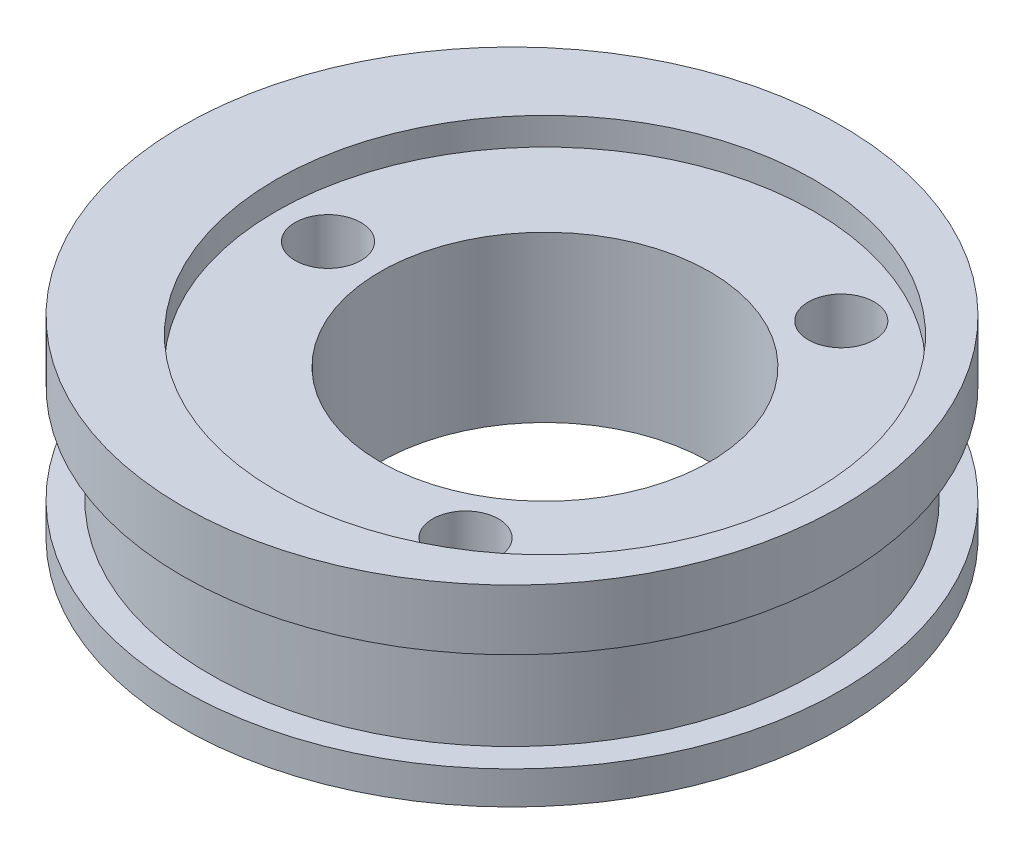
ISO-10303-21;
HEADER;
FILE_DESCRIPTION(('STEP AP214'),'2;1');
FILE_NAME('part.step','',(''),(''),'','','');
FILE_SCHEMA(('AUTOMOTIVE_DESIGN { 1 0 10303 214 1 1 1 1 }'));
ENDSEC;
DATA;
#1=APPLICATION_CONTEXT('core data for automotive mechanical design processes');
#2=APPLICATION_PROTOCOL_DEFINITION('international standard','automotive_design',2000,#1);
#3=PRODUCT_CONTEXT('',#1,'mechanical');
#4=PRODUCT('Part','Part','',(#3));
#5=PRODUCT_RELATED_PRODUCT_CATEGORY('part','',(#4));
#6=PRODUCT_DEFINITION_FORMATION('','',#4);
#7=PRODUCT_DEFINITION_CONTEXT('part definition',#1,'design');
#8=PRODUCT_DEFINITION('design','',#6,#7);
#9=PRODUCT_DEFINITION_SHAPE('','',#8);
#10=(LENGTH_UNIT() NAMED_UNIT(*) SI_UNIT(.MILLI.,.METRE.));
#11=(NAMED_UNIT(*) PLANE_ANGLE_UNIT() SI_UNIT($,.RADIAN.));
#12=(NAMED_UNIT(*) SI_UNIT($,.STERADIAN.) SOLID_ANGLE_UNIT());
#13=UNCERTAINTY_MEASURE_WITH_UNIT(LENGTH_MEASURE(1.E-05),#10,'distance_accuracy_value','');
#14=(GEOMETRIC_REPRESENTATION_CONTEXT(3) GLOBAL_UNCERTAINTY_ASSIGNED_CONTEXT((#13)) GLOBAL_UNIT_ASSIGNED_CONTEXT((#10,
#11,#12)) REPRESENTATION_CONTEXT('',''));
#15=CARTESIAN_POINT('',(0.,0.,0.));
#16=DIRECTION('',(0.,0.,1.));
#17=DIRECTION('',(1.,0.,0.));
#18=AXIS2_PLACEMENT_3D('',#15,#16,#17);
#19=CARTESIAN_POINT('',(0.,3.,0.));
#20=DIRECTION('',(0.,-1.,0.));
#21=DIRECTION('',(0.,0.,-1.));
#22=AXIS2_PLACEMENT_3D('',#19,#20,#21);
#23=PLANE('',#22);
#24=CARTESIAN_POINT('',(0.,3.,0.));
#25=DIRECTION('',(0.,-1.,0.));
#26=DIRECTION('',(0.,0.,-1.));
#27=AXIS2_PLACEMENT_3D('',#24,#25,#26);
#28=CIRCLE('',#27,27.5);
#29=CARTESIAN_POINT('',(0.,3.,-27.5));
#30=VERTEX_POINT('',#29);
#31=EDGE_CURVE('E80',#30,#30,#28,.T.);
#32=ORIENTED_EDGE('',*,*,#31,.T.);
#33=EDGE_LOOP('',(#32));
#34=FACE_BOUND('',#33,.T.);
#35=CARTESIAN_POINT('',(0.,3.,0.));
#36=DIRECTION('',(0.,-1.,0.));
#37=DIRECTION('',(0.,0.,-1.));
#38=AXIS2_PLACEMENT_3D('',#35,#36,#37);
#39=CIRCLE('',#38,30.);
#40=CARTESIAN_POINT('',(0.,3.,-30.));
#41=VERTEX_POINT('',#40);
#42=EDGE_CURVE('E73',#41,#41,#39,.T.);
#43=ORIENTED_EDGE('',*,*,#42,.F.);
#44=EDGE_LOOP('',(#43));
#45=FACE_BOUND('',#44,.T.);
#46=ADVANCED_FACE('F43',(#34,#45),#23,.F.);
#47=CARTESIAN_POINT('',(0.,0.,0.));
#48=DIRECTION('',(0.,1.,0.));
#49=DIRECTION('',(0.,0.,1.));
#50=AXIS2_PLACEMENT_3D('',#47,#48,#49);
#51=PLANE('',#50);
#52=CARTESIAN_POINT('',(-7.50000000000035,0.,-18.186533479473));
#53=DIRECTION('',(0.,1.,0.));
#54=DIRECTION('',(0.,0.,1.));
#55=AXIS2_PLACEMENT_3D('',#52,#53,#54);
#56=CIRCLE('',#55,2.20000000000001);
#57=CARTESIAN_POINT('',(-7.50000000000035,0.,-15.986533479473));
#58=VERTEX_POINT('',#57);
#59=EDGE_CURVE('E55',#58,#58,#56,.T.);
#60=ORIENTED_EDGE('',*,*,#59,.T.);
#61=EDGE_LOOP('',(#60));
#62=FACE_BOUND('',#61,.T.);
#63=CARTESIAN_POINT('',(24.,0.,0.));
#64=DIRECTION('',(0.,1.,0.));
#65=DIRECTION('',(0.,0.,1.));
#66=AXIS2_PLACEMENT_3D('',#63,#64,#65);
#67=CIRCLE('',#66,2.20000000000001);
#68=CARTESIAN_POINT('',(24.,0.,-2.20000000000001));
#69=VERTEX_POINT('',#68);
#70=EDGE_CURVE('E59',#69,#69,#67,.T.);
#71=ORIENTED_EDGE('',*,*,#70,.T.);
#72=EDGE_LOOP('',(#71));
#73=FACE_BOUND('',#72,.T.);
#74=CARTESIAN_POINT('',(-7.49999999999958,0.,18.1865334794735));
#75=DIRECTION('',(0.,1.,0.));
#76=DIRECTION('',(0.,0.,1.));
#77=AXIS2_PLACEMENT_3D('',#74,#75,#76);
#78=CIRCLE('',#77,2.20000000000001);
#79=CARTESIAN_POINT('',(-7.49999999999958,0.,20.3865334794735));
#80=VERTEX_POINT('',#79);
#81=EDGE_CURVE('E64',#80,#80,#78,.T.);
#82=ORIENTED_EDGE('',*,*,#81,.T.);
#83=EDGE_LOOP('',(#82));
#84=FACE_BOUND('',#83,.T.);
#85=CARTESIAN_POINT('',(3.,0.,0.));
#86=DIRECTION('',(0.,-1.,0.));
#87=DIRECTION('',(0.,0.,-1.));
#88=AXIS2_PLACEMENT_3D('',#85,#86,#87);
#89=CIRCLE('',#88,15.);
#90=CARTESIAN_POINT('',(3.,0.,-15.));
#91=VERTEX_POINT('',#90);
#92=EDGE_CURVE('E70',#91,#91,#89,.F.);
#93=ORIENTED_EDGE('',*,*,#92,.T.);
#94=EDGE_LOOP('',(#93));
#95=FACE_BOUND('',#94,.T.);
#96=CARTESIAN_POINT('',(0.,0.,0.));
#97=DIRECTION('',(0.,-1.,0.));
#98=DIRECTION('',(0.,0.,-1.));
#99=AXIS2_PLACEMENT_3D('',#96,#97,#98);
#100=CIRCLE('',#99,30.);
#101=CARTESIAN_POINT('',(0.,0.,-30.));
#102=VERTEX_POINT('',#101);
#103=EDGE_CURVE('E74',#102,#102,#100,.T.);
#104=ORIENTED_EDGE('',*,*,#103,.T.);
#105=EDGE_LOOP('',(#104));
#106=FACE_BOUND('',#105,.T.);
#107=ADVANCED_FACE('F166',(#62,#73,#84,#95,#106),#51,.F.);
#108=CARTESIAN_POINT('',(3.,0.,0.));
#109=DIRECTION('',(0.,1.,0.));
#110=DIRECTION('',(0.,0.,1.));
#111=AXIS2_PLACEMENT_3D('',#108,#109,#110);
#112=CYLINDRICAL_SURFACE('',#111,15.);
#113=ORIENTED_EDGE('',*,*,#92,.F.);
#114=EDGE_LOOP('',(#113));
#115=FACE_BOUND('',#114,.T.);
#116=CARTESIAN_POINT('',(3.,15.,0.));
#117=DIRECTION('',(0.,1.,0.));
#118=DIRECTION('',(0.,0.,1.));
#119=AXIS2_PLACEMENT_3D('',#116,#117,#118);
#120=CIRCLE('',#119,15.);
#121=CARTESIAN_POINT('',(3.,15.,15.));
#122=VERTEX_POINT('',#121);
#123=EDGE_CURVE('E96',#122,#122,#120,.T.);
#124=ORIENTED_EDGE('',*,*,#123,.T.);
#125=EDGE_LOOP('',(#124));
#126=FACE_BOUND('',#125,.T.);
#127=ADVANCED_FACE('F169',(#115,#126),#112,.F.);
#128=CARTESIAN_POINT('',(0.,3.,0.));
#129=DIRECTION('',(0.,-1.,0.));
#130=DIRECTION('',(0.,0.,-1.));
#131=AXIS2_PLACEMENT_3D('',#128,#129,#130);
#132=CYLINDRICAL_SURFACE('',#131,30.);
#133=ORIENTED_EDGE('',*,*,#42,.T.);
#134=EDGE_LOOP('',(#133));
#135=FACE_BOUND('',#134,.T.);
#136=ORIENTED_EDGE('',*,*,#103,.F.);
#137=EDGE_LOOP('',(#136));
#138=FACE_BOUND('',#137,.T.);
#139=ADVANCED_FACE('F175',(#135,#138),#132,.T.);
#140=CARTESIAN_POINT('',(0.,15.,0.));
#141=DIRECTION('',(0.,-1.,0.));
#142=DIRECTION('',(0.,0.,-1.));
#143=AXIS2_PLACEMENT_3D('',#140,#141,#142);
#144=CYLINDRICAL_SURFACE('',#143,27.5);
#145=CARTESIAN_POINT('',(0.,12.,0.));
#146=DIRECTION('',(0.,1.,0.));
#147=DIRECTION('',(0.,0.,1.));
#148=AXIS2_PLACEMENT_3D('',#145,#146,#147);
#149=CIRCLE('',#148,27.5);
#150=CARTESIAN_POINT('',(0.,12.,27.5));
#151=VERTEX_POINT('',#150);
#152=EDGE_CURVE('E83',#151,#151,#149,.T.);
#153=ORIENTED_EDGE('',*,*,#152,.F.);
#154=EDGE_LOOP('',(#153));
#155=FACE_BOUND('',#154,.T.);
#156=ORIENTED_EDGE('',*,*,#31,.F.);
#157=EDGE_LOOP('',(#156));
#158=FACE_BOUND('',#157,.T.);
#159=ADVANCED_FACE('F184',(#155,#158),#144,.T.);
#160=CARTESIAN_POINT('',(0.,15.,0.));
#161=DIRECTION('',(0.,1.,0.));
#162=DIRECTION('',(0.,0.,1.));
#163=AXIS2_PLACEMENT_3D('',#160,#161,#162);
#164=PLANE('',#163);
#165=ORIENTED_EDGE('',*,*,#123,.F.);
#166=EDGE_LOOP('',(#165));
#167=FACE_BOUND('',#166,.T.);
#168=CARTESIAN_POINT('',(-16.75,15.,0.));
#169=DIRECTION('',(0.,1.,0.));
#170=DIRECTION('',(0.,0.,1.));
#171=AXIS2_PLACEMENT_3D('',#168,#169,#170);
#172=CIRCLE('',#171,3.);
#173=CARTESIAN_POINT('',(-16.75,15.,3.));
#174=VERTEX_POINT('',#173);
#175=EDGE_CURVE('E117',#174,#174,#172,.T.);
#176=ORIENTED_EDGE('',*,*,#175,.F.);
#177=EDGE_LOOP('',(#176));
#178=FACE_BOUND('',#177,.T.);
#179=CARTESIAN_POINT('',(12.8750000000001,15.,-17.1040017247429));
#180=DIRECTION('',(0.,1.,0.));
#181=DIRECTION('',(0.,0.,1.));
#182=AXIS2_PLACEMENT_3D('',#179,#180,#181);
#183=CIRCLE('',#182,3.);
#184=CARTESIAN_POINT('',(12.8750000000001,15.,-14.1040017247429));
#185=VERTEX_POINT('',#184);
#186=EDGE_CURVE('E124',#185,#185,#183,.T.);
#187=ORIENTED_EDGE('',*,*,#186,.F.);
#188=EDGE_LOOP('',(#187));
#189=FACE_BOUND('',#188,.T.);
#190=CARTESIAN_POINT('',(12.8749999999998,15.,17.1040017247425));
#191=DIRECTION('',(0.,1.,0.));
#192=DIRECTION('',(0.,0.,1.));
#193=AXIS2_PLACEMENT_3D('',#190,#191,#192);
#194=CIRCLE('',#193,3.);
#195=CARTESIAN_POINT('',(12.8749999999998,15.,20.1040017247425));
#196=VERTEX_POINT('',#195);
#197=EDGE_CURVE('E113',#196,#196,#194,.T.);
#198=ORIENTED_EDGE('',*,*,#197,.F.);
#199=EDGE_LOOP('',(#198));
#200=FACE_BOUND('',#199,.T.);
#201=CARTESIAN_POINT('',(3.,15.,0.));
#202=DIRECTION('',(0.,1.,0.));
#203=DIRECTION('',(0.,0.,1.));
#204=AXIS2_PLACEMENT_3D('',#201,#202,#203);
#205=CIRCLE('',#204,24.5);
#206=CARTESIAN_POINT('',(3.,15.,24.5));
#207=VERTEX_POINT('',#206);
#208=EDGE_CURVE('E118',#207,#207,#205,.T.);
#209=ORIENTED_EDGE('',*,*,#208,.T.);
#210=EDGE_LOOP('',(#209));
#211=FACE_BOUND('',#210,.T.);
#212=ADVANCED_FACE('F192',(#167,#178,#189,#200,#211),#164,.T.);
#213=CARTESIAN_POINT('',(3.,17.5,0.));
#214=DIRECTION('',(0.,-1.,0.));
#215=DIRECTION('',(0.,0.,-1.));
#216=AXIS2_PLACEMENT_3D('',#213,#214,#215);
#217=CYLINDRICAL_SURFACE('',#216,24.5);
#218=CARTESIAN_POINT('',(3.,17.5,0.));
#219=DIRECTION('',(0.,1.,0.));
#220=DIRECTION('',(0.,0.,1.));
#221=AXIS2_PLACEMENT_3D('',#218,#219,#220);
#222=CIRCLE('',#221,24.5);
#223=CARTESIAN_POINT('',(3.,17.5,24.5));
#224=VERTEX_POINT('',#223);
#225=EDGE_CURVE('E132',#224,#224,#222,.T.);
#226=ORIENTED_EDGE('',*,*,#225,.T.);
#227=EDGE_LOOP('',(#226));
#228=FACE_BOUND('',#227,.T.);
#229=ORIENTED_EDGE('',*,*,#208,.F.);
#230=EDGE_LOOP('',(#229));
#231=FACE_BOUND('',#230,.T.);
#232=ADVANCED_FACE('F254',(#228,#231),#217,.F.);
#233=CARTESIAN_POINT('',(0.,17.5,0.));
#234=DIRECTION('',(0.,1.,0.));
#235=DIRECTION('',(0.,0.,1.));
#236=AXIS2_PLACEMENT_3D('',#233,#234,#235);
#237=PLANE('',#236);
#238=ORIENTED_EDGE('',*,*,#225,.F.);
#239=EDGE_LOOP('',(#238));
#240=FACE_BOUND('',#239,.T.);
#241=CARTESIAN_POINT('',(0.,17.5,0.));
#242=DIRECTION('',(0.,1.,0.));
#243=DIRECTION('',(0.,0.,1.));
#244=AXIS2_PLACEMENT_3D('',#241,#242,#243);
#245=CIRCLE('',#244,30.);
#246=CARTESIAN_POINT('',(0.,17.5,30.));
#247=VERTEX_POINT('',#246);
#248=EDGE_CURVE('E77',#247,#247,#245,.T.);
#249=ORIENTED_EDGE('',*,*,#248,.T.);
#250=EDGE_LOOP('',(#249));
#251=FACE_BOUND('',#250,.T.);
#252=ADVANCED_FACE('F250',(#240,#251),#237,.T.);
#253=CARTESIAN_POINT('',(12.8749999999998,10.,17.1040017247425));
#254=DIRECTION('',(0.,1.,0.));
#255=DIRECTION('',(0.,0.,1.));
#256=AXIS2_PLACEMENT_3D('',#253,#254,#255);
#257=CYLINDRICAL_SURFACE('',#256,3.);
#258=CARTESIAN_POINT('',(12.8749999999998,10.,17.1040017247425));
#259=DIRECTION('',(0.,1.,0.));
#260=DIRECTION('',(0.,0.,1.));
#261=AXIS2_PLACEMENT_3D('',#258,#259,#260);
#262=CIRCLE('',#261,3.);
#263=CARTESIAN_POINT('',(12.8749999999998,10.,20.1040017247425));
#264=VERTEX_POINT('',#263);
#265=EDGE_CURVE('E127',#264,#264,#262,.T.);
#266=ORIENTED_EDGE('',*,*,#265,.F.);
#267=EDGE_LOOP('',(#266));
#268=FACE_BOUND('',#267,.T.);
#269=ORIENTED_EDGE('',*,*,#197,.T.);
#270=EDGE_LOOP('',(#269));
#271=FACE_BOUND('',#270,.T.);
#272=ADVANCED_FACE('F246',(#268,#271),#257,.F.);
#273=CARTESIAN_POINT('',(0.,10.,0.));
#274=DIRECTION('',(0.,1.,0.));
#275=DIRECTION('',(0.,0.,1.));
#276=AXIS2_PLACEMENT_3D('',#273,#274,#275);
#277=PLANE('',#276);
#278=CARTESIAN_POINT('',(12.8750000000001,10.,17.1040017247423));
#279=DIRECTION('',(0.,1.,0.));
#280=DIRECTION('',(0.,0.,1.));
#281=AXIS2_PLACEMENT_3D('',#278,#279,#280);
#282=CIRCLE('',#281,2.);
#283=CARTESIAN_POINT('',(12.8750000000001,10.,19.1040017247423));
#284=VERTEX_POINT('',#283);
#285=EDGE_CURVE('E89',#284,#284,#282,.T.);
#286=ORIENTED_EDGE('',*,*,#285,.F.);
#287=EDGE_LOOP('',(#286));
#288=FACE_BOUND('',#287,.T.);
#289=ORIENTED_EDGE('',*,*,#265,.T.);
#290=EDGE_LOOP('',(#289));
#291=FACE_BOUND('',#290,.T.);
#292=ADVANCED_FACE('F242',(#288,#291),#277,.T.);
#293=CARTESIAN_POINT('',(12.8750000000001,10.,-17.1040017247429));
#294=DIRECTION('',(0.,1.,0.));
#295=DIRECTION('',(0.,0.,1.));
#296=AXIS2_PLACEMENT_3D('',#293,#294,#295);
#297=CYLINDRICAL_SURFACE('',#296,3.);
#298=CARTESIAN_POINT('',(12.8750000000001,10.,-17.1040017247429));
#299=DIRECTION('',(0.,1.,0.));
#300=DIRECTION('',(0.,0.,1.));
#301=AXIS2_PLACEMENT_3D('',#298,#299,#300);
#302=CIRCLE('',#301,3.);
#303=CARTESIAN_POINT('',(12.8750000000001,10.,-14.1040017247429));
#304=VERTEX_POINT('',#303);
#305=EDGE_CURVE('E121',#304,#304,#302,.T.);
#306=ORIENTED_EDGE('',*,*,#305,.F.);
#307=EDGE_LOOP('',(#306));
#308=FACE_BOUND('',#307,.T.);
#309=ORIENTED_EDGE('',*,*,#186,.T.);
#310=EDGE_LOOP('',(#309));
#311=FACE_BOUND('',#310,.T.);
#312=ADVANCED_FACE('F238',(#308,#311),#297,.F.);
#313=CARTESIAN_POINT('',(0.,10.,0.));
#314=DIRECTION('',(0.,1.,0.));
#315=DIRECTION('',(0.,0.,1.));
#316=AXIS2_PLACEMENT_3D('',#313,#314,#315);
#317=PLANE('',#316);
#318=CARTESIAN_POINT('',(12.8749999999998,10.,-17.104001724743));
#319=DIRECTION('',(0.,1.,0.));
#320=DIRECTION('',(0.,0.,1.));
#321=AXIS2_PLACEMENT_3D('',#318,#319,#320);
#322=CIRCLE('',#321,2.);
#323=CARTESIAN_POINT('',(12.8749999999998,10.,-15.104001724743));
#324=VERTEX_POINT('',#323);
#325=EDGE_CURVE('E102',#324,#324,#322,.T.);
#326=ORIENTED_EDGE('',*,*,#325,.F.);
#327=EDGE_LOOP('',(#326));
#328=FACE_BOUND('',#327,.T.);
#329=ORIENTED_EDGE('',*,*,#305,.T.);
#330=EDGE_LOOP('',(#329));
#331=FACE_BOUND('',#330,.T.);
#332=ADVANCED_FACE('F234',(#328,#331),#317,.T.);
#333=CARTESIAN_POINT('',(-16.75,10.,0.));
#334=DIRECTION('',(0.,1.,0.));
#335=DIRECTION('',(0.,0.,1.));
#336=AXIS2_PLACEMENT_3D('',#333,#334,#335);
#337=CYLINDRICAL_SURFACE('',#336,3.);
#338=CARTESIAN_POINT('',(-16.75,10.,0.));
#339=DIRECTION('',(0.,1.,0.));
#340=DIRECTION('',(0.,0.,1.));
#341=AXIS2_PLACEMENT_3D('',#338,#339,#340);
#342=CIRCLE('',#341,3.);
#343=CARTESIAN_POINT('',(-16.75,10.,3.));
#344=VERTEX_POINT('',#343);
#345=EDGE_CURVE('E114',#344,#344,#342,.T.);
#346=ORIENTED_EDGE('',*,*,#345,.F.);
#347=EDGE_LOOP('',(#346));
#348=FACE_BOUND('',#347,.T.);
#349=ORIENTED_EDGE('',*,*,#175,.T.);
#350=EDGE_LOOP('',(#349));
#351=FACE_BOUND('',#350,.T.);
#352=ADVANCED_FACE('F230',(#348,#351),#337,.F.);
#353=CARTESIAN_POINT('',(0.,10.,0.));
#354=DIRECTION('',(0.,1.,0.));
#355=DIRECTION('',(0.,0.,1.));
#356=AXIS2_PLACEMENT_3D('',#353,#354,#355);
#357=PLANE('',#356);
#358=CARTESIAN_POINT('',(-16.75,10.,0.));
#359=DIRECTION('',(0.,1.,0.));
#360=DIRECTION('',(0.,0.,1.));
#361=AXIS2_PLACEMENT_3D('',#358,#359,#360);
#362=CIRCLE('',#361,2.);
#363=CARTESIAN_POINT('',(-16.75,10.,2.));
#364=VERTEX_POINT('',#363);
#365=EDGE_CURVE('E95',#364,#364,#362,.T.);
#366=ORIENTED_EDGE('',*,*,#365,.F.);
#367=EDGE_LOOP('',(#366));
#368=FACE_BOUND('',#367,.T.);
#369=ORIENTED_EDGE('',*,*,#345,.T.);
#370=EDGE_LOOP('',(#369));
#371=FACE_BOUND('',#370,.T.);
#372=ADVANCED_FACE('F212',(#368,#371),#357,.T.);
#373=CARTESIAN_POINT('',(-16.75,7.5,0.));
#374=DIRECTION('',(0.,1.,0.));
#375=DIRECTION('',(0.,0.,1.));
#376=AXIS2_PLACEMENT_3D('',#373,#374,#375);
#377=CYLINDRICAL_SURFACE('',#376,2.);
#378=CARTESIAN_POINT('',(-16.75,7.5,0.));
#379=DIRECTION('',(0.,1.,0.));
#380=DIRECTION('',(0.,0.,1.));
#381=AXIS2_PLACEMENT_3D('',#378,#379,#380);
#382=CIRCLE('',#381,2.);
#383=CARTESIAN_POINT('',(-16.75,7.5,2.));
#384=VERTEX_POINT('',#383);
#385=EDGE_CURVE('E92',#384,#384,#382,.T.);
#386=ORIENTED_EDGE('',*,*,#385,.F.);
#387=EDGE_LOOP('',(#386));
#388=FACE_BOUND('',#387,.T.);
#389=ORIENTED_EDGE('',*,*,#365,.T.);
#390=EDGE_LOOP('',(#389));
#391=FACE_BOUND('',#390,.T.);
#392=ADVANCED_FACE('F208',(#388,#391),#377,.F.);
#393=CARTESIAN_POINT('',(0.,7.5,0.));
#394=DIRECTION('',(0.,1.,0.));
#395=DIRECTION('',(0.,0.,1.));
#396=AXIS2_PLACEMENT_3D('',#393,#394,#395);
#397=PLANE('',#396);
#398=ORIENTED_EDGE('',*,*,#385,.T.);
#399=EDGE_LOOP('',(#398));
#400=FACE_BOUND('',#399,.T.);
#401=ADVANCED_FACE('F204',(#400),#397,.T.);
#402=CARTESIAN_POINT('',(12.8749999999998,7.5,-17.104001724743));
#403=DIRECTION('',(0.,1.,0.));
#404=DIRECTION('',(0.,0.,1.));
#405=AXIS2_PLACEMENT_3D('',#402,#403,#404);
#406=CYLINDRICAL_SURFACE('',#405,2.);
#407=CARTESIAN_POINT('',(12.8749999999998,7.5,-17.104001724743));
#408=DIRECTION('',(0.,1.,0.));
#409=DIRECTION('',(0.,0.,1.));
#410=AXIS2_PLACEMENT_3D('',#407,#408,#409);
#411=CIRCLE('',#410,2.);
#412=CARTESIAN_POINT('',(12.8749999999998,7.5,-15.104001724743));
#413=VERTEX_POINT('',#412);
#414=EDGE_CURVE('E99',#413,#413,#411,.T.);
#415=ORIENTED_EDGE('',*,*,#414,.F.);
#416=EDGE_LOOP('',(#415));
#417=FACE_BOUND('',#416,.T.);
#418=ORIENTED_EDGE('',*,*,#325,.T.);
#419=EDGE_LOOP('',(#418));
#420=FACE_BOUND('',#419,.T.);
#421=ADVANCED_FACE('F207',(#417,#420),#406,.F.);
#422=CARTESIAN_POINT('',(0.,7.5,0.));
#423=DIRECTION('',(0.,1.,0.));
#424=DIRECTION('',(0.,0.,1.));
#425=AXIS2_PLACEMENT_3D('',#422,#423,#424);
#426=PLANE('',#425);
#427=ORIENTED_EDGE('',*,*,#414,.T.);
#428=EDGE_LOOP('',(#427));
#429=FACE_BOUND('',#428,.T.);
#430=ADVANCED_FACE('F214',(#429),#426,.T.);
#431=CARTESIAN_POINT('',(12.8750000000001,7.5,17.1040017247423));
#432=DIRECTION('',(0.,1.,0.));
#433=DIRECTION('',(0.,0.,1.));
#434=AXIS2_PLACEMENT_3D('',#431,#432,#433);
#435=CYLINDRICAL_SURFACE('',#434,2.);
#436=CARTESIAN_POINT('',(12.8750000000001,7.5,17.1040017247423));
#437=DIRECTION('',(0.,1.,0.));
#438=DIRECTION('',(0.,0.,1.));
#439=AXIS2_PLACEMENT_3D('',#436,#437,#438);
#440=CIRCLE('',#439,2.);
#441=CARTESIAN_POINT('',(12.8750000000001,7.5,19.1040017247423));
#442=VERTEX_POINT('',#441);
#443=EDGE_CURVE('E105',#442,#442,#440,.T.);
#444=ORIENTED_EDGE('',*,*,#443,.F.);
#445=EDGE_LOOP('',(#444));
#446=FACE_BOUND('',#445,.T.);
#447=ORIENTED_EDGE('',*,*,#285,.T.);
#448=EDGE_LOOP('',(#447));
#449=FACE_BOUND('',#448,.T.);
#450=ADVANCED_FACE('F217',(#446,#449),#435,.F.);
#451=CARTESIAN_POINT('',(0.,7.5,0.));
#452=DIRECTION('',(0.,1.,0.));
#453=DIRECTION('',(0.,0.,1.));
#454=AXIS2_PLACEMENT_3D('',#451,#452,#453);
#455=PLANE('',#454);
#456=ORIENTED_EDGE('',*,*,#443,.T.);
#457=EDGE_LOOP('',(#456));
#458=FACE_BOUND('',#457,.T.);
#459=ADVANCED_FACE('F202',(#458),#455,.T.);
#460=CARTESIAN_POINT('',(0.,12.,0.));
#461=DIRECTION('',(0.,1.,0.));
#462=DIRECTION('',(0.,0.,1.));
#463=AXIS2_PLACEMENT_3D('',#460,#461,#462);
#464=CYLINDRICAL_SURFACE('',#463,30.);
#465=CARTESIAN_POINT('',(0.,12.,0.));
#466=DIRECTION('',(0.,1.,0.));
#467=DIRECTION('',(0.,0.,1.));
#468=AXIS2_PLACEMENT_3D('',#465,#466,#467);
#469=CIRCLE('',#468,30.);
#470=CARTESIAN_POINT('',(0.,12.,30.));
#471=VERTEX_POINT('',#470);
#472=EDGE_CURVE('E85',#471,#471,#469,.T.);
#473=ORIENTED_EDGE('',*,*,#472,.T.);
#474=EDGE_LOOP('',(#473));
#475=FACE_BOUND('',#474,.T.);
#476=ORIENTED_EDGE('',*,*,#248,.F.);
#477=EDGE_LOOP('',(#476));
#478=FACE_BOUND('',#477,.T.);
#479=ADVANCED_FACE('F198',(#475,#478),#464,.T.);
#480=CARTESIAN_POINT('',(0.,12.,0.));
#481=DIRECTION('',(0.,1.,0.));
#482=DIRECTION('',(0.,0.,1.));
#483=AXIS2_PLACEMENT_3D('',#480,#481,#482);
#484=PLANE('',#483);
#485=ORIENTED_EDGE('',*,*,#152,.T.);
#486=EDGE_LOOP('',(#485));
#487=FACE_BOUND('',#486,.T.);
#488=ORIENTED_EDGE('',*,*,#472,.F.);
#489=EDGE_LOOP('',(#488));
#490=FACE_BOUND('',#489,.T.);
#491=ADVANCED_FACE('F194',(#487,#490),#484,.F.);
#492=CARTESIAN_POINT('',(-7.50000000000035,10.,-18.186533479473));
#493=DIRECTION('',(0.,-1.,0.));
#494=DIRECTION('',(0.,0.,-1.));
#495=AXIS2_PLACEMENT_3D('',#492,#493,#494);
#496=CYLINDRICAL_SURFACE('',#495,1.);
#497=CARTESIAN_POINT('',(-7.50000000000035,1.2,-18.186533479473));
#498=DIRECTION('',(0.,1.,0.));
#499=DIRECTION('',(0.,0.,1.));
#500=AXIS2_PLACEMENT_3D('',#497,#498,#499);
#501=CIRCLE('',#500,1.);
#502=CARTESIAN_POINT('',(-7.50000000000035,1.2,-17.186533479473));
#503=VERTEX_POINT('',#502);
#504=EDGE_CURVE('E67',#503,#503,#501,.F.);
#505=ORIENTED_EDGE('',*,*,#504,.T.);
#506=EDGE_LOOP('',(#505));
#507=FACE_BOUND('',#506,.T.);
#508=CARTESIAN_POINT('',(-7.50000000000035,10.,-18.186533479473));
#509=DIRECTION('',(0.,-1.,0.));
#510=DIRECTION('',(0.,0.,-1.));
#511=AXIS2_PLACEMENT_3D('',#508,#509,#510);
#512=CIRCLE('',#511,1.);
#513=CARTESIAN_POINT('',(-7.50000000000035,10.,-19.186533479473));
#514=VERTEX_POINT('',#513);
#515=EDGE_CURVE('E141',#514,#514,#512,.T.);
#516=ORIENTED_EDGE('',*,*,#515,.F.);
#517=EDGE_LOOP('',(#516));
#518=FACE_BOUND('',#517,.T.);
#519=ADVANCED_FACE('F197',(#507,#518),#496,.F.);
#520=CARTESIAN_POINT('',(0.,10.,0.));
#521=DIRECTION('',(0.,-1.,0.));
#522=DIRECTION('',(0.,0.,-1.));
#523=AXIS2_PLACEMENT_3D('',#520,#521,#522);
#524=PLANE('',#523);
#525=ORIENTED_EDGE('',*,*,#515,.T.);
#526=EDGE_LOOP('',(#525));
#527=FACE_BOUND('',#526,.T.);
#528=ADVANCED_FACE('F264',(#527),#524,.T.);
#529=CARTESIAN_POINT('',(-7.49999999999958,10.,18.1865334794735));
#530=DIRECTION('',(0.,-1.,0.));
#531=DIRECTION('',(0.,0.,-1.));
#532=AXIS2_PLACEMENT_3D('',#529,#530,#531);
#533=CYLINDRICAL_SURFACE('',#532,1.);
#534=CARTESIAN_POINT('',(-7.49999999999958,1.2,18.1865334794735));
#535=DIRECTION('',(0.,1.,0.));
#536=DIRECTION('',(0.,0.,1.));
#537=AXIS2_PLACEMENT_3D('',#534,#535,#536);
#538=CIRCLE('',#537,1.);
#539=CARTESIAN_POINT('',(-7.49999999999958,1.2,19.1865334794735));
#540=VERTEX_POINT('',#539);
#541=EDGE_CURVE('E10',#540,#540,#538,.F.);
#542=ORIENTED_EDGE('',*,*,#541,.T.);
#543=EDGE_LOOP('',(#542));
#544=FACE_BOUND('',#543,.T.);
#545=CARTESIAN_POINT('',(-7.49999999999958,10.,18.1865334794735));
#546=DIRECTION('',(0.,-1.,0.));
#547=DIRECTION('',(0.,0.,-1.));
#548=AXIS2_PLACEMENT_3D('',#545,#546,#547);
#549=CIRCLE('',#548,1.);
#550=CARTESIAN_POINT('',(-7.49999999999958,10.,17.1865334794735));
#551=VERTEX_POINT('',#550);
#552=EDGE_CURVE('E144',#551,#551,#549,.T.);
#553=ORIENTED_EDGE('',*,*,#552,.F.);
#554=EDGE_LOOP('',(#553));
#555=FACE_BOUND('',#554,.T.);
#556=ADVANCED_FACE('F162',(#544,#555),#533,.F.);
#557=CARTESIAN_POINT('',(0.,10.,0.));
#558=DIRECTION('',(0.,-1.,0.));
#559=DIRECTION('',(0.,0.,-1.));
#560=AXIS2_PLACEMENT_3D('',#557,#558,#559);
#561=PLANE('',#560);
#562=ORIENTED_EDGE('',*,*,#552,.T.);
#563=EDGE_LOOP('',(#562));
#564=FACE_BOUND('',#563,.T.);
#565=ADVANCED_FACE('F154',(#564),#561,.T.);
#566=CARTESIAN_POINT('',(24.,10.,0.));
#567=DIRECTION('',(0.,-1.,0.));
#568=DIRECTION('',(0.,0.,-1.));
#569=AXIS2_PLACEMENT_3D('',#566,#567,#568);
#570=CYLINDRICAL_SURFACE('',#569,1.);
#571=CARTESIAN_POINT('',(24.,1.2,0.));
#572=DIRECTION('',(0.,1.,0.));
#573=DIRECTION('',(0.,0.,1.));
#574=AXIS2_PLACEMENT_3D('',#571,#572,#573);
#575=CIRCLE('',#574,1.);
#576=CARTESIAN_POINT('',(24.,1.2,-1.));
#577=VERTEX_POINT('',#576);
#578=EDGE_CURVE('E51',#577,#577,#575,.F.);
#579=ORIENTED_EDGE('',*,*,#578,.T.);
#580=EDGE_LOOP('',(#579));
#581=FACE_BOUND('',#580,.T.);
#582=CARTESIAN_POINT('',(24.,10.,0.));
#583=DIRECTION('',(0.,-1.,0.));
#584=DIRECTION('',(0.,0.,-1.));
#585=AXIS2_PLACEMENT_3D('',#582,#583,#584);
#586=CIRCLE('',#585,1.);
#587=CARTESIAN_POINT('',(24.,10.,-1.));
#588=VERTEX_POINT('',#587);
#589=EDGE_CURVE('E84',#588,#588,#586,.T.);
#590=ORIENTED_EDGE('',*,*,#589,.F.);
#591=EDGE_LOOP('',(#590));
#592=FACE_BOUND('',#591,.T.);
#593=ADVANCED_FACE('F152',(#581,#592),#570,.F.);
#594=CARTESIAN_POINT('',(0.,10.,0.));
#595=DIRECTION('',(0.,-1.,0.));
#596=DIRECTION('',(0.,0.,-1.));
#597=AXIS2_PLACEMENT_3D('',#594,#595,#596);
#598=PLANE('',#597);
#599=ORIENTED_EDGE('',*,*,#589,.T.);
#600=EDGE_LOOP('',(#599));
#601=FACE_BOUND('',#600,.T.);
#602=ADVANCED_FACE('F150',(#601),#598,.T.);
#603=CARTESIAN_POINT('',(-7.50000000000035,1.2,-18.186533479473));
#604=DIRECTION('',(0.,-1.,0.));
#605=DIRECTION('',(0.,0.,-1.));
#606=AXIS2_PLACEMENT_3D('',#603,#604,#605);
#607=CONICAL_SURFACE('',#606,1.,0.78539816339745);
#608=ORIENTED_EDGE('',*,*,#59,.F.);
#609=EDGE_LOOP('',(#608));
#610=FACE_BOUND('',#609,.T.);
#611=ORIENTED_EDGE('',*,*,#504,.F.);
#612=EDGE_LOOP('',(#611));
#613=FACE_BOUND('',#612,.T.);
#614=ADVANCED_FACE('F160',(#610,#613),#607,.F.);
#615=CARTESIAN_POINT('',(24.,1.2,0.));
#616=DIRECTION('',(0.,-1.,0.));
#617=DIRECTION('',(0.,0.,-1.));
#618=AXIS2_PLACEMENT_3D('',#615,#616,#617);
#619=CONICAL_SURFACE('',#618,1.,0.78539816339745);
#620=CARTESIAN_POINT('',(24.,0.,-2.20000000000001));
#621=CARTESIAN_POINT('',(24.,0.0124999999999997,-2.18750000000001));
#622=CARTESIAN_POINT('',(24.,0.0249999999999998,-2.17500000000001));
#623=CARTESIAN_POINT('',(24.,0.05,-2.15000000000001));
#624=CARTESIAN_POINT('',(24.,0.0625000000000001,-2.13750000000001));
#625=CARTESIAN_POINT('',(24.,0.0875000000000001,-2.11250000000001));
#626=CARTESIAN_POINT('',(24.,0.1,-2.10000000000001));
#627=CARTESIAN_POINT('',(24.,0.125,-2.07500000000001));
#628=CARTESIAN_POINT('',(24.,0.1375,-2.06250000000001));
#629=CARTESIAN_POINT('',(24.,0.1625,-2.03750000000001));
#630=CARTESIAN_POINT('',(24.,0.175,-2.02500000000001));
#631=CARTESIAN_POINT('',(24.,0.2,-2.00000000000001));
#632=CARTESIAN_POINT('',(24.,0.2125,-1.98750000000001));
#633=CARTESIAN_POINT('',(24.,0.2375,-1.96250000000001));
#634=CARTESIAN_POINT('',(24.,0.25,-1.95000000000001));
#635=CARTESIAN_POINT('',(24.,0.275000000000001,-1.92500000000001));
#636=CARTESIAN_POINT('',(24.,0.287500000000001,-1.91250000000001));
#637=CARTESIAN_POINT('',(24.,0.312500000000001,-1.88750000000001));
#638=CARTESIAN_POINT('',(24.,0.325000000000001,-1.87500000000001));
#639=CARTESIAN_POINT('',(24.,0.350000000000001,-1.85000000000001));
#640=CARTESIAN_POINT('',(24.,0.362500000000001,-1.83750000000001));
#641=CARTESIAN_POINT('',(24.,0.387500000000001,-1.81250000000001));
#642=CARTESIAN_POINT('',(24.,0.400000000000001,-1.80000000000001));
#643=CARTESIAN_POINT('',(24.,0.425000000000001,-1.77500000000001));
#644=CARTESIAN_POINT('',(24.,0.437500000000001,-1.76250000000001));
#645=CARTESIAN_POINT('',(24.,0.462500000000001,-1.73750000000001));
#646=CARTESIAN_POINT('',(24.,0.475000000000001,-1.72500000000001));
#647=CARTESIAN_POINT('',(24.,0.500000000000001,-1.70000000000001));
#648=CARTESIAN_POINT('',(24.,0.512500000000001,-1.68750000000001));
#649=CARTESIAN_POINT('',(24.,0.537500000000001,-1.6625));
#650=CARTESIAN_POINT('',(24.,0.550000000000001,-1.65000000000001));
#651=CARTESIAN_POINT('',(24.,0.575000000000001,-1.625));
#652=CARTESIAN_POINT('',(24.,0.587500000000001,-1.6125));
#653=CARTESIAN_POINT('',(24.,0.612500000000001,-1.5875));
#654=CARTESIAN_POINT('',(24.,0.625000000000002,-1.575));
#655=CARTESIAN_POINT('',(24.,0.650000000000002,-1.55));
#656=CARTESIAN_POINT('',(24.,0.662500000000002,-1.5375));
#657=CARTESIAN_POINT('',(24.,0.687500000000002,-1.5125));
#658=CARTESIAN_POINT('',(24.,0.700000000000002,-1.5));
#659=CARTESIAN_POINT('',(24.,0.725000000000002,-1.475));
#660=CARTESIAN_POINT('',(24.,0.737500000000002,-1.4625));
#661=CARTESIAN_POINT('',(24.,0.762500000000002,-1.4375));
#662=CARTESIAN_POINT('',(24.,0.775000000000002,-1.425));
#663=CARTESIAN_POINT('',(24.,0.800000000000002,-1.4));
#664=CARTESIAN_POINT('',(24.,0.812500000000002,-1.3875));
#665=CARTESIAN_POINT('',(24.,0.837500000000002,-1.3625));
#666=CARTESIAN_POINT('',(24.,0.850000000000002,-1.35));
#667=CARTESIAN_POINT('',(24.,0.875000000000002,-1.325));
#668=CARTESIAN_POINT('',(24.,0.887500000000002,-1.3125));
#669=CARTESIAN_POINT('',(24.,0.912500000000002,-1.2875));
#670=CARTESIAN_POINT('',(24.,0.925000000000002,-1.275));
#671=CARTESIAN_POINT('',(24.,0.950000000000002,-1.25));
#672=CARTESIAN_POINT('',(24.,0.962500000000002,-1.2375));
#673=CARTESIAN_POINT('',(24.,0.987500000000002,-1.2125));
#674=CARTESIAN_POINT('',(24.,1.,-1.2));
#675=CARTESIAN_POINT('',(24.,1.025,-1.175));
#676=CARTESIAN_POINT('',(24.,1.0375,-1.1625));
#677=CARTESIAN_POINT('',(24.,1.0625,-1.1375));
#678=CARTESIAN_POINT('',(24.,1.075,-1.125));
#679=CARTESIAN_POINT('',(24.,1.1,-1.1));
#680=CARTESIAN_POINT('',(24.,1.1125,-1.0875));
#681=CARTESIAN_POINT('',(24.,1.1375,-1.0625));
#682=CARTESIAN_POINT('',(24.,1.15,-1.05));
#683=CARTESIAN_POINT('',(24.,1.175,-1.025));
#684=CARTESIAN_POINT('',(24.,1.1875,-1.0125));
#685=CARTESIAN_POINT('',(24.,1.2,-1.));
#686=B_SPLINE_CURVE_WITH_KNOTS('',3,(#620,#621,#622,#623,#624,#625,#626,#627,#628,#629,#630,
#631,#632,#633,#634,#635,#636,#637,#638,#639,#640,#641,#642,#643,#644,#645,#646,#647,#648,#649,
#650,#651,#652,#653,#654,#655,#656,#657,#658,#659,#660,#661,#662,#663,#664,#665,#666,#667,#668,
#669,#670,#671,#672,#673,#674,#675,#676,#677,#678,#679,#680,#681,#682,#683,#684,#685),
.UNSPECIFIED.,.F.,.F.,(4,2,2,2,2,2,2,2,2,2,2,2,2,2,2,2,2,2,2,2,2,2,2,2,2,2,2,2,2,2,2,2,4),(0.,
0.0530330085889917,0.106066017177983,0.159099025766974,0.212132034355965,0.265165042944957,
0.318198051533948,0.371231060122939,0.424264068711931,0.477297077300922,0.530330085889913,
0.583363094478904,0.636396103067896,0.689429111656887,0.742462120245878,0.795495128834869,
0.848528137423861,0.901561146012852,0.954594154601843,1.00762716319083,1.06066017177983,
1.11369318036882,1.16672618895781,1.2197591975468,1.27279220613579,1.32582521472478,
1.37885822331377,1.43189123190276,1.48492424049176,1.53795724908075,1.59099025766974,
1.64402326625873,1.69705627484772),.UNSPECIFIED.);
#687=EDGE_CURVE('BSEAM468',#69,#577,#686,.T.);
#688=ORIENTED_EDGE('',*,*,#70,.F.);
#689=ORIENTED_EDGE('',*,*,#578,.F.);
#690=ORIENTED_EDGE('',*,*,#687,.T.);
#691=ORIENTED_EDGE('',*,*,#687,.F.);
#692=EDGE_LOOP('',(#688,#690,#689,#691));
#693=FACE_BOUND('',#692,.T.);
#694=ADVANCED_FACE('F468',(#693),#619,.F.);
#695=CARTESIAN_POINT('',(-7.49999999999958,1.2,18.1865334794735));
#696=DIRECTION('',(0.,-1.,0.));
#697=DIRECTION('',(0.,0.,-1.));
#698=AXIS2_PLACEMENT_3D('',#695,#696,#697);
#699=CONICAL_SURFACE('',#698,1.,0.78539816339745);
#700=ORIENTED_EDGE('',*,*,#81,.F.);
#701=EDGE_LOOP('',(#700));
#702=FACE_BOUND('',#701,.T.);
#703=ORIENTED_EDGE('',*,*,#541,.F.);
#704=EDGE_LOOP('',(#703));
#705=FACE_BOUND('',#704,.T.);
#706=ADVANCED_FACE('F46',(#702,#705),#699,.F.);
#707=CLOSED_SHELL('',(#46,#107,#127,#139,#159,#212,#232,#252,#272,#292,#312,#332,#352,#372,#392,
#401,#421,#430,#450,#459,#479,#491,#519,#528,#556,#565,#593,#602,#614,#694,#706));
#708=MANIFOLD_SOLID_BREP('B2',#707);
#709=ADVANCED_BREP_SHAPE_REPRESENTATION('',(#18,#708),#14);
#710=SHAPE_DEFINITION_REPRESENTATION(#9,#709);
ENDSEC;
END-ISO-10303-21;
